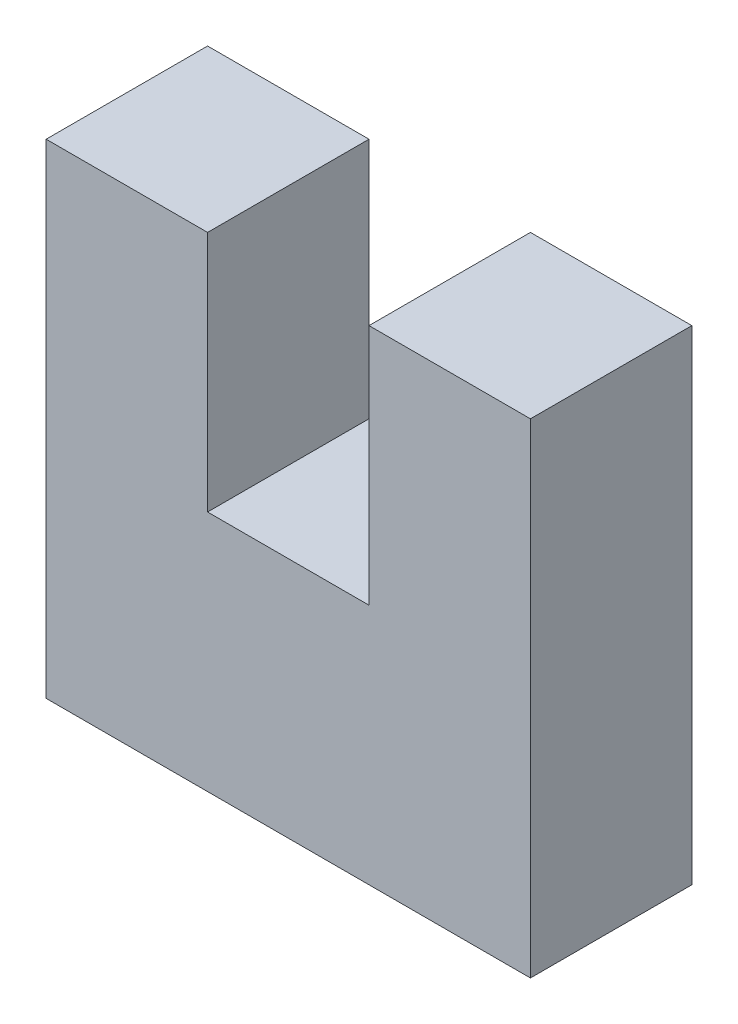
ISO-10303-21;
HEADER;
FILE_DESCRIPTION(('STEP AP214'),'2;1');
FILE_NAME('part.step','',(''),(''),'','','');
FILE_SCHEMA(('AUTOMOTIVE_DESIGN { 1 0 10303 214 1 1 1 1 }'));
ENDSEC;
DATA;
#1=APPLICATION_CONTEXT('core data for automotive mechanical design processes');
#2=APPLICATION_PROTOCOL_DEFINITION('international standard','automotive_design',2000,#1);
#3=PRODUCT_CONTEXT('',#1,'mechanical');
#4=PRODUCT('Part','Part','',(#3));
#5=PRODUCT_RELATED_PRODUCT_CATEGORY('part','',(#4));
#6=PRODUCT_DEFINITION_FORMATION('','',#4);
#7=PRODUCT_DEFINITION_CONTEXT('part definition',#1,'design');
#8=PRODUCT_DEFINITION('design','',#6,#7);
#9=PRODUCT_DEFINITION_SHAPE('','',#8);
#10=(LENGTH_UNIT() NAMED_UNIT(*) SI_UNIT(.MILLI.,.METRE.));
#11=(NAMED_UNIT(*) PLANE_ANGLE_UNIT() SI_UNIT($,.RADIAN.));
#12=(NAMED_UNIT(*) SI_UNIT($,.STERADIAN.) SOLID_ANGLE_UNIT());
#13=UNCERTAINTY_MEASURE_WITH_UNIT(LENGTH_MEASURE(1.E-05),#10,'distance_accuracy_value','');
#14=(GEOMETRIC_REPRESENTATION_CONTEXT(3) GLOBAL_UNCERTAINTY_ASSIGNED_CONTEXT((#13)) GLOBAL_UNIT_ASSIGNED_CONTEXT((#10,
#11,#12)) REPRESENTATION_CONTEXT('',''));
#15=CARTESIAN_POINT('',(0.,0.,0.));
#16=DIRECTION('',(0.,0.,1.));
#17=DIRECTION('',(1.,0.,0.));
#18=AXIS2_PLACEMENT_3D('',#15,#16,#17);
#19=CARTESIAN_POINT('',(-13.0747540983607,-9.53540983606557,5.08));
#20=DIRECTION('',(1.,0.,0.));
#21=DIRECTION('',(0.,0.,-1.));
#22=AXIS2_PLACEMENT_3D('',#19,#20,#21);
#23=PLANE('',#22);
#24=DIRECTION('',(0.,-1.,0.));
#25=VECTOR('',#24,1.);
#26=CARTESIAN_POINT('',(-13.0747540983607,-9.53540983606557,0.));
#27=LINE('',#26,#25);
#28=CARTESIAN_POINT('',(-13.0747540983607,5.70459016393443,0.));
#29=VERTEX_POINT('',#28);
#30=CARTESIAN_POINT('',(-13.0747540983607,-9.53540983606557,0.));
#31=VERTEX_POINT('',#30);
#32=EDGE_CURVE('E129',#29,#31,#27,.T.);
#33=ORIENTED_EDGE('',*,*,#32,.T.);
#34=DIRECTION('',(0.,0.,-1.));
#35=VECTOR('',#34,1.);
#36=CARTESIAN_POINT('',(-13.0747540983607,-9.53540983606557,5.08));
#37=LINE('',#36,#35);
#38=CARTESIAN_POINT('',(-13.0747540983607,-9.53540983606557,5.08));
#39=VERTEX_POINT('',#38);
#40=EDGE_CURVE('E11',#39,#31,#37,.T.);
#41=ORIENTED_EDGE('',*,*,#40,.F.);
#42=DIRECTION('',(0.,-1.,0.));
#43=VECTOR('',#42,1.);
#44=CARTESIAN_POINT('',(-13.0747540983607,-9.53540983606557,5.08));
#45=LINE('',#44,#43);
#46=CARTESIAN_POINT('',(-13.0747540983607,5.70459016393443,5.08));
#47=VERTEX_POINT('',#46);
#48=EDGE_CURVE('E143',#47,#39,#45,.T.);
#49=ORIENTED_EDGE('',*,*,#48,.F.);
#50=DIRECTION('',(0.,0.,-1.));
#51=VECTOR('',#50,1.);
#52=CARTESIAN_POINT('',(-13.0747540983607,5.70459016393443,5.08));
#53=LINE('',#52,#51);
#54=EDGE_CURVE('E125',#47,#29,#53,.T.);
#55=ORIENTED_EDGE('',*,*,#54,.T.);
#56=EDGE_LOOP('',(#33,#41,#49,#55));
#57=FACE_BOUND('',#56,.T.);
#58=ADVANCED_FACE('F33',(#57),#23,.F.);
#59=CARTESIAN_POINT('',(2.16524590163934,-9.53540983606557,5.08));
#60=DIRECTION('',(0.,1.,0.));
#61=DIRECTION('',(0.,0.,1.));
#62=AXIS2_PLACEMENT_3D('',#59,#60,#61);
#63=PLANE('',#62);
#64=DIRECTION('',(1.,0.,0.));
#65=VECTOR('',#64,1.);
#66=CARTESIAN_POINT('',(2.16524590163934,-9.53540983606557,0.));
#67=LINE('',#66,#65);
#68=CARTESIAN_POINT('',(2.16524590163934,-9.53540983606557,0.));
#69=VERTEX_POINT('',#68);
#70=EDGE_CURVE('E132',#31,#69,#67,.T.);
#71=ORIENTED_EDGE('',*,*,#70,.T.);
#72=DIRECTION('',(0.,0.,-1.));
#73=VECTOR('',#72,1.);
#74=CARTESIAN_POINT('',(2.16524590163934,-9.53540983606557,5.08));
#75=LINE('',#74,#73);
#76=CARTESIAN_POINT('',(2.16524590163934,-9.53540983606557,5.08));
#77=VERTEX_POINT('',#76);
#78=EDGE_CURVE('E41',#77,#69,#75,.T.);
#79=ORIENTED_EDGE('',*,*,#78,.F.);
#80=DIRECTION('',(1.,0.,0.));
#81=VECTOR('',#80,1.);
#82=CARTESIAN_POINT('',(2.16524590163934,-9.53540983606557,5.08));
#83=LINE('',#82,#81);
#84=EDGE_CURVE('E92',#39,#77,#83,.T.);
#85=ORIENTED_EDGE('',*,*,#84,.F.);
#86=ORIENTED_EDGE('',*,*,#40,.T.);
#87=EDGE_LOOP('',(#71,#79,#85,#86));
#88=FACE_BOUND('',#87,.T.);
#89=ADVANCED_FACE('F178',(#88),#63,.F.);
#90=CARTESIAN_POINT('',(2.16524590163934,5.70459016393443,5.08));
#91=DIRECTION('',(-1.,0.,0.));
#92=DIRECTION('',(0.,-1.,0.));
#93=AXIS2_PLACEMENT_3D('',#90,#91,#92);
#94=PLANE('',#93);
#95=DIRECTION('',(0.,1.,0.));
#96=VECTOR('',#95,1.);
#97=CARTESIAN_POINT('',(2.16524590163934,5.70459016393443,0.));
#98=LINE('',#97,#96);
#99=CARTESIAN_POINT('',(2.16524590163934,5.70459016393443,0.));
#100=VERTEX_POINT('',#99);
#101=EDGE_CURVE('E134',#69,#100,#98,.T.);
#102=ORIENTED_EDGE('',*,*,#101,.T.);
#103=DIRECTION('',(0.,0.,-1.));
#104=VECTOR('',#103,1.);
#105=CARTESIAN_POINT('',(2.16524590163934,5.70459016393443,5.08));
#106=LINE('',#105,#104);
#107=CARTESIAN_POINT('',(2.16524590163934,5.70459016393443,5.08));
#108=VERTEX_POINT('',#107);
#109=EDGE_CURVE('E150',#108,#100,#106,.T.);
#110=ORIENTED_EDGE('',*,*,#109,.F.);
#111=DIRECTION('',(0.,1.,0.));
#112=VECTOR('',#111,1.);
#113=CARTESIAN_POINT('',(2.16524590163934,5.70459016393443,5.08));
#114=LINE('',#113,#112);
#115=EDGE_CURVE('E158',#77,#108,#114,.T.);
#116=ORIENTED_EDGE('',*,*,#115,.F.);
#117=ORIENTED_EDGE('',*,*,#78,.T.);
#118=EDGE_LOOP('',(#102,#110,#116,#117));
#119=FACE_BOUND('',#118,.T.);
#120=ADVANCED_FACE('F156',(#119),#94,.F.);
#121=CARTESIAN_POINT('',(-2.91475409836066,5.70459016393443,5.08));
#122=DIRECTION('',(0.,-1.,0.));
#123=DIRECTION('',(0.,0.,-1.));
#124=AXIS2_PLACEMENT_3D('',#121,#122,#123);
#125=PLANE('',#124);
#126=DIRECTION('',(-1.,0.,0.));
#127=VECTOR('',#126,1.);
#128=CARTESIAN_POINT('',(-2.91475409836066,5.70459016393443,0.));
#129=LINE('',#128,#127);
#130=CARTESIAN_POINT('',(-2.91475409836066,5.70459016393443,0.));
#131=VERTEX_POINT('',#130);
#132=EDGE_CURVE('E136',#100,#131,#129,.T.);
#133=ORIENTED_EDGE('',*,*,#132,.T.);
#134=DIRECTION('',(0.,0.,-1.));
#135=VECTOR('',#134,1.);
#136=CARTESIAN_POINT('',(-2.91475409836066,5.70459016393443,5.08));
#137=LINE('',#136,#135);
#138=CARTESIAN_POINT('',(-2.91475409836066,5.70459016393443,5.08));
#139=VERTEX_POINT('',#138);
#140=EDGE_CURVE('E147',#139,#131,#137,.T.);
#141=ORIENTED_EDGE('',*,*,#140,.F.);
#142=DIRECTION('',(-1.,0.,0.));
#143=VECTOR('',#142,1.);
#144=CARTESIAN_POINT('',(-2.91475409836066,5.70459016393443,5.08));
#145=LINE('',#144,#143);
#146=EDGE_CURVE('E170',#108,#139,#145,.T.);
#147=ORIENTED_EDGE('',*,*,#146,.F.);
#148=ORIENTED_EDGE('',*,*,#109,.T.);
#149=EDGE_LOOP('',(#133,#141,#147,#148));
#150=FACE_BOUND('',#149,.T.);
#151=ADVANCED_FACE('F166',(#150),#125,.F.);
#152=CARTESIAN_POINT('',(-2.91475409836066,-1.91540983606557,5.08));
#153=DIRECTION('',(1.,0.,0.));
#154=DIRECTION('',(0.,0.,-1.));
#155=AXIS2_PLACEMENT_3D('',#152,#153,#154);
#156=PLANE('',#155);
#157=DIRECTION('',(0.,-1.,0.));
#158=VECTOR('',#157,1.);
#159=CARTESIAN_POINT('',(-2.91475409836066,-1.91540983606557,0.));
#160=LINE('',#159,#158);
#161=CARTESIAN_POINT('',(-2.91475409836066,-1.91540983606557,0.));
#162=VERTEX_POINT('',#161);
#163=EDGE_CURVE('E138',#131,#162,#160,.T.);
#164=ORIENTED_EDGE('',*,*,#163,.T.);
#165=DIRECTION('',(0.,0.,-1.));
#166=VECTOR('',#165,1.);
#167=CARTESIAN_POINT('',(-2.91475409836066,-1.91540983606557,5.08));
#168=LINE('',#167,#166);
#169=CARTESIAN_POINT('',(-2.91475409836066,-1.91540983606557,5.08));
#170=VERTEX_POINT('',#169);
#171=EDGE_CURVE('E120',#170,#162,#168,.T.);
#172=ORIENTED_EDGE('',*,*,#171,.F.);
#173=DIRECTION('',(0.,-1.,0.));
#174=VECTOR('',#173,1.);
#175=CARTESIAN_POINT('',(-2.91475409836066,-1.91540983606557,5.08));
#176=LINE('',#175,#174);
#177=EDGE_CURVE('E111',#139,#170,#176,.T.);
#178=ORIENTED_EDGE('',*,*,#177,.F.);
#179=ORIENTED_EDGE('',*,*,#140,.T.);
#180=EDGE_LOOP('',(#164,#172,#178,#179));
#181=FACE_BOUND('',#180,.T.);
#182=ADVANCED_FACE('F169',(#181),#156,.F.);
#183=CARTESIAN_POINT('',(-7.99475409836065,-1.91540983606557,5.08));
#184=DIRECTION('',(0.,-1.,0.));
#185=DIRECTION('',(0.,0.,-1.));
#186=AXIS2_PLACEMENT_3D('',#183,#184,#185);
#187=PLANE('',#186);
#188=DIRECTION('',(-1.,0.,0.));
#189=VECTOR('',#188,1.);
#190=CARTESIAN_POINT('',(-7.99475409836065,-1.91540983606557,0.));
#191=LINE('',#190,#189);
#192=CARTESIAN_POINT('',(-7.99475409836065,-1.91540983606557,0.));
#193=VERTEX_POINT('',#192);
#194=EDGE_CURVE('E119',#162,#193,#191,.T.);
#195=ORIENTED_EDGE('',*,*,#194,.T.);
#196=DIRECTION('',(0.,0.,-1.));
#197=VECTOR('',#196,1.);
#198=CARTESIAN_POINT('',(-7.99475409836065,-1.91540983606557,5.08));
#199=LINE('',#198,#197);
#200=CARTESIAN_POINT('',(-7.99475409836065,-1.91540983606557,5.08));
#201=VERTEX_POINT('',#200);
#202=EDGE_CURVE('E116',#201,#193,#199,.T.);
#203=ORIENTED_EDGE('',*,*,#202,.F.);
#204=DIRECTION('',(-1.,0.,0.));
#205=VECTOR('',#204,1.);
#206=CARTESIAN_POINT('',(-7.99475409836065,-1.91540983606557,5.08));
#207=LINE('',#206,#205);
#208=EDGE_CURVE('E105',#170,#201,#207,.T.);
#209=ORIENTED_EDGE('',*,*,#208,.F.);
#210=ORIENTED_EDGE('',*,*,#171,.T.);
#211=EDGE_LOOP('',(#195,#203,#209,#210));
#212=FACE_BOUND('',#211,.T.);
#213=ADVANCED_FACE('F117',(#212),#187,.F.);
#214=CARTESIAN_POINT('',(-7.99475409836066,5.70459016393443,5.08));
#215=DIRECTION('',(-1.,0.,0.));
#216=DIRECTION('',(0.,-1.,0.));
#217=AXIS2_PLACEMENT_3D('',#214,#215,#216);
#218=PLANE('',#217);
#219=DIRECTION('',(0.,1.,0.));
#220=VECTOR('',#219,1.);
#221=CARTESIAN_POINT('',(-7.99475409836066,5.70459016393443,0.));
#222=LINE('',#221,#220);
#223=CARTESIAN_POINT('',(-7.99475409836066,5.70459016393443,0.));
#224=VERTEX_POINT('',#223);
#225=EDGE_CURVE('E78',#193,#224,#222,.T.);
#226=ORIENTED_EDGE('',*,*,#225,.T.);
#227=DIRECTION('',(0.,0.,-1.));
#228=VECTOR('',#227,1.);
#229=CARTESIAN_POINT('',(-7.99475409836066,5.70459016393443,5.08));
#230=LINE('',#229,#228);
#231=CARTESIAN_POINT('',(-7.99475409836066,5.70459016393443,5.08));
#232=VERTEX_POINT('',#231);
#233=EDGE_CURVE('E121',#232,#224,#230,.T.);
#234=ORIENTED_EDGE('',*,*,#233,.F.);
#235=DIRECTION('',(0.,1.,0.));
#236=VECTOR('',#235,1.);
#237=CARTESIAN_POINT('',(-7.99475409836066,5.70459016393443,5.08));
#238=LINE('',#237,#236);
#239=EDGE_CURVE('E109',#201,#232,#238,.T.);
#240=ORIENTED_EDGE('',*,*,#239,.F.);
#241=ORIENTED_EDGE('',*,*,#202,.T.);
#242=EDGE_LOOP('',(#226,#234,#240,#241));
#243=FACE_BOUND('',#242,.T.);
#244=ADVANCED_FACE('F123',(#243),#218,.F.);
#245=CARTESIAN_POINT('',(-13.0747540983607,5.70459016393443,5.08));
#246=DIRECTION('',(0.,-1.,0.));
#247=DIRECTION('',(0.,0.,-1.));
#248=AXIS2_PLACEMENT_3D('',#245,#246,#247);
#249=PLANE('',#248);
#250=DIRECTION('',(-1.,0.,0.));
#251=VECTOR('',#250,1.);
#252=CARTESIAN_POINT('',(-13.0747540983607,5.70459016393443,0.));
#253=LINE('',#252,#251);
#254=EDGE_CURVE('E84',#224,#29,#253,.T.);
#255=ORIENTED_EDGE('',*,*,#254,.T.);
#256=ORIENTED_EDGE('',*,*,#54,.F.);
#257=DIRECTION('',(-1.,0.,0.));
#258=VECTOR('',#257,1.);
#259=CARTESIAN_POINT('',(-13.0747540983607,5.70459016393443,5.08));
#260=LINE('',#259,#258);
#261=EDGE_CURVE('E49',#232,#47,#260,.T.);
#262=ORIENTED_EDGE('',*,*,#261,.F.);
#263=ORIENTED_EDGE('',*,*,#233,.T.);
#264=EDGE_LOOP('',(#255,#256,#262,#263));
#265=FACE_BOUND('',#264,.T.);
#266=ADVANCED_FACE('F194',(#265),#249,.F.);
#267=CARTESIAN_POINT('',(0.,0.,5.08));
#268=DIRECTION('',(0.,0.,-1.));
#269=DIRECTION('',(-1.,0.,0.));
#270=AXIS2_PLACEMENT_3D('',#267,#268,#269);
#271=PLANE('',#270);
#272=ORIENTED_EDGE('',*,*,#48,.T.);
#273=ORIENTED_EDGE('',*,*,#84,.T.);
#274=ORIENTED_EDGE('',*,*,#115,.T.);
#275=ORIENTED_EDGE('',*,*,#146,.T.);
#276=ORIENTED_EDGE('',*,*,#177,.T.);
#277=ORIENTED_EDGE('',*,*,#208,.T.);
#278=ORIENTED_EDGE('',*,*,#239,.T.);
#279=ORIENTED_EDGE('',*,*,#261,.T.);
#280=EDGE_LOOP('',(#272,#273,#274,#275,#276,#277,#278,#279));
#281=FACE_BOUND('',#280,.T.);
#282=ADVANCED_FACE('F107',(#281),#271,.F.);
#283=CARTESIAN_POINT('',(0.,0.,0.));
#284=DIRECTION('',(0.,0.,-1.));
#285=DIRECTION('',(-1.,0.,0.));
#286=AXIS2_PLACEMENT_3D('',#283,#284,#285);
#287=PLANE('',#286);
#288=ORIENTED_EDGE('',*,*,#32,.F.);
#289=ORIENTED_EDGE('',*,*,#254,.F.);
#290=ORIENTED_EDGE('',*,*,#225,.F.);
#291=ORIENTED_EDGE('',*,*,#194,.F.);
#292=ORIENTED_EDGE('',*,*,#163,.F.);
#293=ORIENTED_EDGE('',*,*,#132,.F.);
#294=ORIENTED_EDGE('',*,*,#101,.F.);
#295=ORIENTED_EDGE('',*,*,#70,.F.);
#296=EDGE_LOOP('',(#288,#289,#290,#291,#292,#293,#294,#295));
#297=FACE_BOUND('',#296,.T.);
#298=ADVANCED_FACE('F162',(#297),#287,.T.);
#299=CLOSED_SHELL('',(#58,#89,#120,#151,#182,#213,#244,#266,#282,#298));
#300=MANIFOLD_SOLID_BREP('B2',#299);
#301=ADVANCED_BREP_SHAPE_REPRESENTATION('',(#18,#300),#14);
#302=SHAPE_DEFINITION_REPRESENTATION(#9,#301);
ENDSEC;
END-ISO-10303-21;
